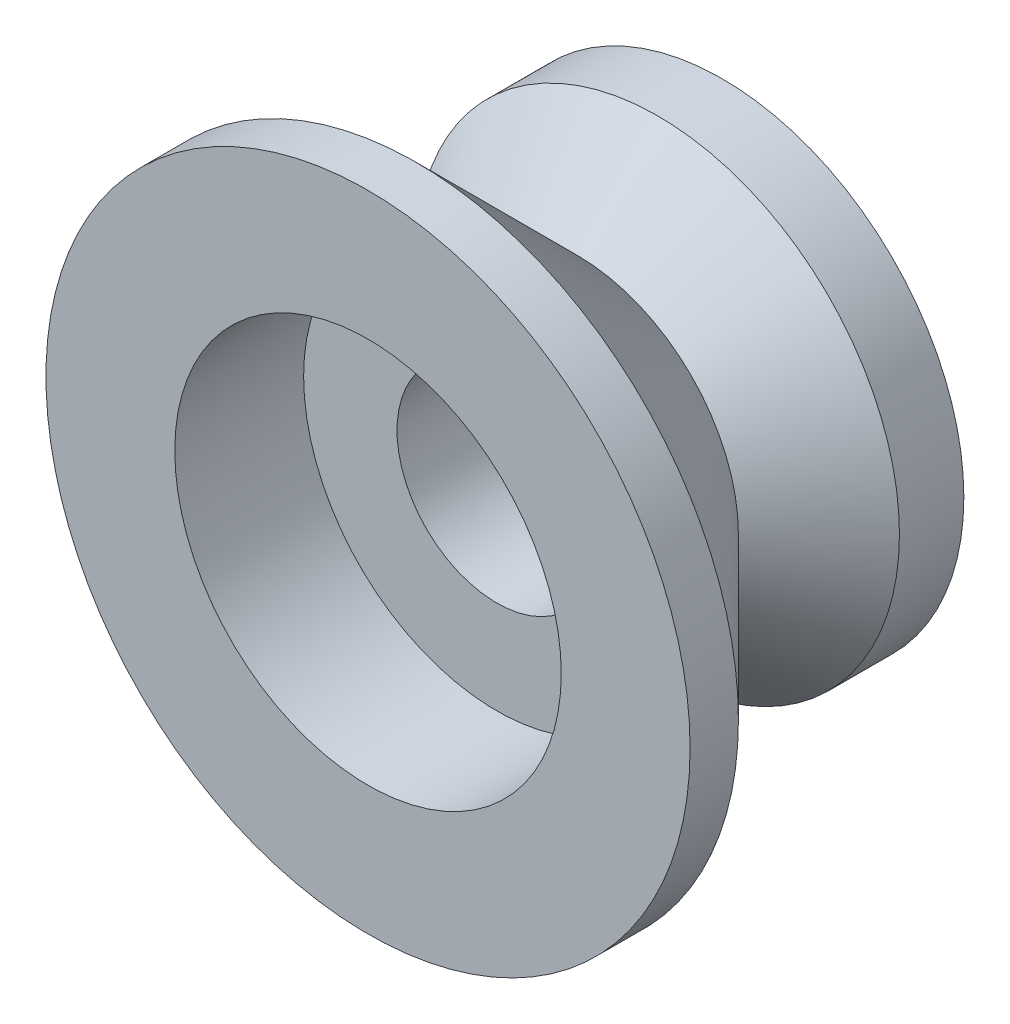
ISO-10303-21;
HEADER;
FILE_DESCRIPTION(('STEP AP214'),'2;1');
FILE_NAME('part.step','',(''),(''),'','','');
FILE_SCHEMA(('AUTOMOTIVE_DESIGN { 1 0 10303 214 1 1 1 1 }'));
ENDSEC;
DATA;
#1=APPLICATION_CONTEXT('core data for automotive mechanical design processes');
#2=APPLICATION_PROTOCOL_DEFINITION('international standard','automotive_design',2000,#1);
#3=PRODUCT_CONTEXT('',#1,'mechanical');
#4=PRODUCT('Part','Part','',(#3));
#5=PRODUCT_RELATED_PRODUCT_CATEGORY('part','',(#4));
#6=PRODUCT_DEFINITION_FORMATION('','',#4);
#7=PRODUCT_DEFINITION_CONTEXT('part definition',#1,'design');
#8=PRODUCT_DEFINITION('design','',#6,#7);
#9=PRODUCT_DEFINITION_SHAPE('','',#8);
#10=(LENGTH_UNIT() NAMED_UNIT(*) SI_UNIT(.MILLI.,.METRE.));
#11=(NAMED_UNIT(*) PLANE_ANGLE_UNIT() SI_UNIT($,.RADIAN.));
#12=(NAMED_UNIT(*) SI_UNIT($,.STERADIAN.) SOLID_ANGLE_UNIT());
#13=UNCERTAINTY_MEASURE_WITH_UNIT(LENGTH_MEASURE(1.E-05),#10,'distance_accuracy_value','');
#14=(GEOMETRIC_REPRESENTATION_CONTEXT(3) GLOBAL_UNCERTAINTY_ASSIGNED_CONTEXT((#13)) GLOBAL_UNIT_ASSIGNED_CONTEXT((#10,
#11,#12)) REPRESENTATION_CONTEXT('',''));
#15=CARTESIAN_POINT('',(0.,0.,0.));
#16=DIRECTION('',(0.,0.,1.));
#17=DIRECTION('',(1.,0.,0.));
#18=AXIS2_PLACEMENT_3D('',#15,#16,#17);
#19=CARTESIAN_POINT('',(3.43024899888577E-12,0.,1000.));
#20=DIRECTION('',(0.,0.,1.));
#21=DIRECTION('',(1.,0.,0.));
#22=AXIS2_PLACEMENT_3D('',#19,#20,#21);
#23=CYLINDRICAL_SURFACE('',#22,7.49999999999997);
#24=CARTESIAN_POINT('',(0.,0.,-8.9999999999999));
#25=DIRECTION('',(0.,0.,1.));
#26=DIRECTION('',(1.,0.,0.));
#27=AXIS2_PLACEMENT_3D('',#24,#25,#26);
#28=CIRCLE('',#27,7.49999999999997);
#29=CARTESIAN_POINT('',(7.49999999999994,0.,-8.99999999999992));
#30=VERTEX_POINT('',#29);
#31=EDGE_CURVE('E64',#30,#30,#28,.T.);
#32=ORIENTED_EDGE('',*,*,#31,.F.);
#33=EDGE_LOOP('',(#32));
#34=FACE_BOUND('',#33,.T.);
#35=CARTESIAN_POINT('',(0.,0.,-10.9999999999999));
#36=DIRECTION('',(0.,0.,1.));
#37=DIRECTION('',(1.,0.,0.));
#38=AXIS2_PLACEMENT_3D('',#35,#36,#37);
#39=CIRCLE('',#38,7.49999999999996);
#40=CARTESIAN_POINT('',(7.49999999999993,0.,-10.9999999999999));
#41=VERTEX_POINT('',#40);
#42=EDGE_CURVE('E10',#41,#41,#39,.T.);
#43=ORIENTED_EDGE('',*,*,#42,.T.);
#44=EDGE_LOOP('',(#43));
#45=FACE_BOUND('',#44,.T.);
#46=ADVANCED_FACE('F41',(#34,#45),#23,.T.);
#47=CARTESIAN_POINT('',(-7.5,0.,-11.));
#48=DIRECTION('',(0.,0.,1.));
#49=DIRECTION('',(1.,0.,0.));
#50=AXIS2_PLACEMENT_3D('',#47,#48,#49);
#51=PLANE('',#50);
#52=CARTESIAN_POINT('',(0.,0.,-10.9999999999999));
#53=DIRECTION('',(0.,0.,1.));
#54=DIRECTION('',(1.,0.,0.));
#55=AXIS2_PLACEMENT_3D('',#52,#53,#54);
#56=CIRCLE('',#55,3.1);
#57=CARTESIAN_POINT('',(3.1,0.,-10.9999999999999));
#58=VERTEX_POINT('',#57);
#59=EDGE_CURVE('E73',#58,#58,#56,.T.);
#60=ORIENTED_EDGE('',*,*,#59,.T.);
#61=EDGE_LOOP('',(#60));
#62=FACE_BOUND('',#61,.T.);
#63=ORIENTED_EDGE('',*,*,#42,.F.);
#64=EDGE_LOOP('',(#63));
#65=FACE_BOUND('',#64,.T.);
#66=ADVANCED_FACE('F85',(#62,#65),#51,.F.);
#67=CARTESIAN_POINT('',(-10.,0.,0.));
#68=DIRECTION('',(0.,0.,-1.));
#69=DIRECTION('',(-1.,0.,0.));
#70=AXIS2_PLACEMENT_3D('',#67,#68,#69);
#71=PLANE('',#70);
#72=CARTESIAN_POINT('',(0.,0.,0.));
#73=DIRECTION('',(0.,0.,1.));
#74=DIRECTION('',(1.,0.,0.));
#75=AXIS2_PLACEMENT_3D('',#72,#73,#74);
#76=CIRCLE('',#75,6.);
#77=CARTESIAN_POINT('',(6.,0.,0.));
#78=VERTEX_POINT('',#77);
#79=EDGE_CURVE('E69',#78,#78,#76,.T.);
#80=ORIENTED_EDGE('',*,*,#79,.F.);
#81=EDGE_LOOP('',(#80));
#82=FACE_BOUND('',#81,.T.);
#83=CARTESIAN_POINT('',(0.,0.,0.));
#84=DIRECTION('',(0.,0.,1.));
#85=DIRECTION('',(1.,0.,0.));
#86=AXIS2_PLACEMENT_3D('',#83,#84,#85);
#87=CIRCLE('',#86,10.);
#88=CARTESIAN_POINT('',(10.,0.,0.));
#89=VERTEX_POINT('',#88);
#90=EDGE_CURVE('E48',#89,#89,#87,.T.);
#91=ORIENTED_EDGE('',*,*,#90,.T.);
#92=EDGE_LOOP('',(#91));
#93=FACE_BOUND('',#92,.T.);
#94=ADVANCED_FACE('F107',(#82,#93),#71,.F.);
#95=CARTESIAN_POINT('',(3.43024899888577E-12,0.,1000.));
#96=DIRECTION('',(0.,0.,1.));
#97=DIRECTION('',(1.,0.,0.));
#98=AXIS2_PLACEMENT_3D('',#95,#96,#97);
#99=CYLINDRICAL_SURFACE('',#98,10.);
#100=ORIENTED_EDGE('',*,*,#90,.F.);
#101=EDGE_LOOP('',(#100));
#102=FACE_BOUND('',#101,.T.);
#103=CARTESIAN_POINT('',(0.,0.,-1.50000000000006));
#104=DIRECTION('',(0.,0.,1.));
#105=DIRECTION('',(1.,0.,0.));
#106=AXIS2_PLACEMENT_3D('',#103,#104,#105);
#107=CIRCLE('',#106,9.99999999999999);
#108=CARTESIAN_POINT('',(9.99999999999999,0.,-1.50000000000009));
#109=VERTEX_POINT('',#108);
#110=EDGE_CURVE('E53',#109,#109,#107,.T.);
#111=ORIENTED_EDGE('',*,*,#110,.T.);
#112=EDGE_LOOP('',(#111));
#113=FACE_BOUND('',#112,.T.);
#114=ADVANCED_FACE('F109',(#102,#113),#99,.T.);
#115=CARTESIAN_POINT('',(0.,0.,-6.49999999999995));
#116=DIRECTION('',(0.,0.,1.));
#117=DIRECTION('',(1.,0.,0.));
#118=AXIS2_PLACEMENT_3D('',#115,#116,#117);
#119=CONICAL_SURFACE('',#118,4.99999999999998,0.785398163397461);
#120=ORIENTED_EDGE('',*,*,#110,.F.);
#121=EDGE_LOOP('',(#120));
#122=FACE_BOUND('',#121,.T.);
#123=CARTESIAN_POINT('',(0.,0.,-6.49999999999995));
#124=DIRECTION('',(0.,0.,1.));
#125=DIRECTION('',(1.,0.,0.));
#126=AXIS2_PLACEMENT_3D('',#123,#124,#125);
#127=CIRCLE('',#126,4.99999999999998);
#128=CARTESIAN_POINT('',(4.99999999999995,0.,-6.49999999999997));
#129=VERTEX_POINT('',#128);
#130=EDGE_CURVE('E58',#129,#129,#127,.T.);
#131=ORIENTED_EDGE('',*,*,#130,.T.);
#132=EDGE_LOOP('',(#131));
#133=FACE_BOUND('',#132,.T.);
#134=ADVANCED_FACE('F115',(#122,#133),#119,.T.);
#135=CARTESIAN_POINT('',(0.,0.,-8.9999999999999));
#136=DIRECTION('',(0.,0.,-1.));
#137=DIRECTION('',(-1.,0.,0.));
#138=AXIS2_PLACEMENT_3D('',#135,#136,#137);
#139=CONICAL_SURFACE('',#138,7.49999999999997,0.785398163397458);
#140=ORIENTED_EDGE('',*,*,#130,.F.);
#141=EDGE_LOOP('',(#140));
#142=FACE_BOUND('',#141,.T.);
#143=ORIENTED_EDGE('',*,*,#31,.T.);
#144=EDGE_LOOP('',(#143));
#145=FACE_BOUND('',#144,.T.);
#146=ADVANCED_FACE('F103',(#142,#145),#139,.T.);
#147=CARTESIAN_POINT('',(0.,0.,-4.));
#148=DIRECTION('',(0.,0.,1.));
#149=DIRECTION('',(1.,0.,0.));
#150=AXIS2_PLACEMENT_3D('',#147,#148,#149);
#151=CYLINDRICAL_SURFACE('',#150,6.);
#152=CARTESIAN_POINT('',(0.,0.,-4.));
#153=DIRECTION('',(0.,0.,1.));
#154=DIRECTION('',(1.,0.,0.));
#155=AXIS2_PLACEMENT_3D('',#152,#153,#154);
#156=CIRCLE('',#155,6.);
#157=CARTESIAN_POINT('',(6.,0.,-4.));
#158=VERTEX_POINT('',#157);
#159=EDGE_CURVE('E68',#158,#158,#156,.T.);
#160=ORIENTED_EDGE('',*,*,#159,.F.);
#161=EDGE_LOOP('',(#160));
#162=FACE_BOUND('',#161,.T.);
#163=ORIENTED_EDGE('',*,*,#79,.T.);
#164=EDGE_LOOP('',(#163));
#165=FACE_BOUND('',#164,.T.);
#166=ADVANCED_FACE('F97',(#162,#165),#151,.F.);
#167=CARTESIAN_POINT('',(0.,0.,-4.));
#168=DIRECTION('',(0.,0.,1.));
#169=DIRECTION('',(1.,0.,0.));
#170=AXIS2_PLACEMENT_3D('',#167,#168,#169);
#171=PLANE('',#170);
#172=CARTESIAN_POINT('',(0.,0.,-4.));
#173=DIRECTION('',(0.,0.,1.));
#174=DIRECTION('',(1.,0.,0.));
#175=AXIS2_PLACEMENT_3D('',#172,#173,#174);
#176=CIRCLE('',#175,3.1);
#177=CARTESIAN_POINT('',(3.1,0.,-4.));
#178=VERTEX_POINT('',#177);
#179=EDGE_CURVE('E77',#178,#178,#176,.T.);
#180=ORIENTED_EDGE('',*,*,#179,.F.);
#181=EDGE_LOOP('',(#180));
#182=FACE_BOUND('',#181,.T.);
#183=ORIENTED_EDGE('',*,*,#159,.T.);
#184=EDGE_LOOP('',(#183));
#185=FACE_BOUND('',#184,.T.);
#186=ADVANCED_FACE('F91',(#182,#185),#171,.T.);
#187=CARTESIAN_POINT('',(0.,0.,-10.9999999999999));
#188=DIRECTION('',(0.,0.,1.));
#189=DIRECTION('',(1.,0.,0.));
#190=AXIS2_PLACEMENT_3D('',#187,#188,#189);
#191=CYLINDRICAL_SURFACE('',#190,3.1);
#192=ORIENTED_EDGE('',*,*,#59,.F.);
#193=EDGE_LOOP('',(#192));
#194=FACE_BOUND('',#193,.T.);
#195=ORIENTED_EDGE('',*,*,#179,.T.);
#196=EDGE_LOOP('',(#195));
#197=FACE_BOUND('',#196,.T.);
#198=ADVANCED_FACE('F88',(#194,#197),#191,.F.);
#199=CLOSED_SHELL('',(#46,#66,#94,#114,#134,#146,#166,#186,#198));
#200=MANIFOLD_SOLID_BREP('B2',#199);
#201=ADVANCED_BREP_SHAPE_REPRESENTATION('',(#18,#200),#14);
#202=SHAPE_DEFINITION_REPRESENTATION(#9,#201);
ENDSEC;
END-ISO-10303-21;
